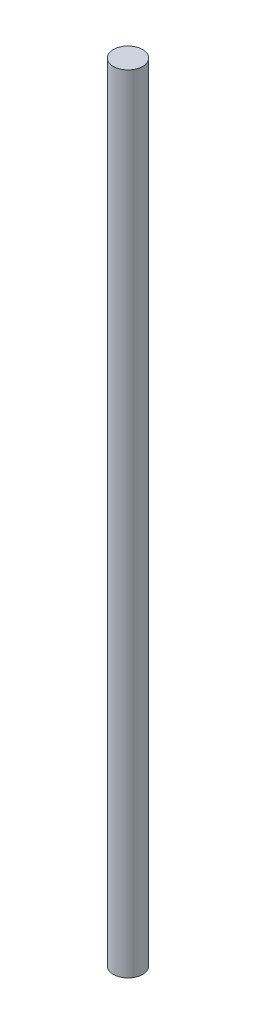
ISO-10303-21;
HEADER;
FILE_DESCRIPTION(('STEP AP214'),'2;1');
FILE_NAME('part.step','',(''),(''),'','','');
FILE_SCHEMA(('AUTOMOTIVE_DESIGN { 1 0 10303 214 1 1 1 1 }'));
ENDSEC;
DATA;
#1=APPLICATION_CONTEXT('core data for automotive mechanical design processes');
#2=APPLICATION_PROTOCOL_DEFINITION('international standard','automotive_design',2000,#1);
#3=PRODUCT_CONTEXT('',#1,'mechanical');
#4=PRODUCT('Part','Part','',(#3));
#5=PRODUCT_RELATED_PRODUCT_CATEGORY('part','',(#4));
#6=PRODUCT_DEFINITION_FORMATION('','',#4);
#7=PRODUCT_DEFINITION_CONTEXT('part definition',#1,'design');
#8=PRODUCT_DEFINITION('design','',#6,#7);
#9=PRODUCT_DEFINITION_SHAPE('','',#8);
#10=(LENGTH_UNIT() NAMED_UNIT(*) SI_UNIT(.MILLI.,.METRE.));
#11=(NAMED_UNIT(*) PLANE_ANGLE_UNIT() SI_UNIT($,.RADIAN.));
#12=(NAMED_UNIT(*) SI_UNIT($,.STERADIAN.) SOLID_ANGLE_UNIT());
#13=UNCERTAINTY_MEASURE_WITH_UNIT(LENGTH_MEASURE(1.E-05),#10,'distance_accuracy_value','');
#14=(GEOMETRIC_REPRESENTATION_CONTEXT(3) GLOBAL_UNCERTAINTY_ASSIGNED_CONTEXT((#13)) GLOBAL_UNIT_ASSIGNED_CONTEXT((#10,
#11,#12)) REPRESENTATION_CONTEXT('',''));
#15=CARTESIAN_POINT('',(0.,0.,0.));
#16=DIRECTION('',(0.,0.,1.));
#17=DIRECTION('',(1.,0.,0.));
#18=AXIS2_PLACEMENT_3D('',#15,#16,#17);
#19=CARTESIAN_POINT('',(0.,76.2,0.));
#20=DIRECTION('',(0.,-1.,0.));
#21=DIRECTION('',(0.,0.,-1.));
#22=AXIS2_PLACEMENT_3D('',#19,#20,#21);
#23=CYLINDRICAL_SURFACE('',#22,1.4224);
#24=CARTESIAN_POINT('',(0.,76.2,0.));
#25=DIRECTION('',(0.,1.,0.));
#26=DIRECTION('',(0.,0.,1.));
#27=AXIS2_PLACEMENT_3D('',#24,#25,#26);
#28=CIRCLE('',#27,1.4224);
#29=CARTESIAN_POINT('',(0.,76.2,-1.4224));
#30=VERTEX_POINT('',#29);
#31=EDGE_CURVE('E10',#30,#30,#28,.T.);
#32=CARTESIAN_POINT('',(0.,0.,0.));
#33=DIRECTION('',(0.,1.,0.));
#34=DIRECTION('',(0.,0.,1.));
#35=AXIS2_PLACEMENT_3D('',#32,#33,#34);
#36=CIRCLE('',#35,1.4224);
#37=CARTESIAN_POINT('',(0.,0.,-1.4224));
#38=VERTEX_POINT('',#37);
#39=EDGE_CURVE('E34',#38,#38,#36,.T.);
#40=CARTESIAN_POINT('',(0.,76.2,-1.4224));
#41=CARTESIAN_POINT('',(0.,75.40625,-1.4224));
#42=CARTESIAN_POINT('',(0.,74.6125,-1.4224));
#43=CARTESIAN_POINT('',(0.,73.025,-1.4224));
#44=CARTESIAN_POINT('',(0.,72.23125,-1.4224));
#45=CARTESIAN_POINT('',(0.,70.64375,-1.4224));
#46=CARTESIAN_POINT('',(0.,69.85,-1.4224));
#47=CARTESIAN_POINT('',(0.,68.2625,-1.4224));
#48=CARTESIAN_POINT('',(0.,67.46875,-1.4224));
#49=CARTESIAN_POINT('',(0.,65.88125,-1.4224));
#50=CARTESIAN_POINT('',(0.,65.0875,-1.4224));
#51=CARTESIAN_POINT('',(0.,63.5,-1.4224));
#52=CARTESIAN_POINT('',(0.,62.70625,-1.4224));
#53=CARTESIAN_POINT('',(0.,61.11875,-1.4224));
#54=CARTESIAN_POINT('',(0.,60.325,-1.4224));
#55=CARTESIAN_POINT('',(0.,58.7375,-1.4224));
#56=CARTESIAN_POINT('',(0.,57.94375,-1.4224));
#57=CARTESIAN_POINT('',(0.,56.35625,-1.4224));
#58=CARTESIAN_POINT('',(0.,55.5625,-1.4224));
#59=CARTESIAN_POINT('',(0.,53.975,-1.4224));
#60=CARTESIAN_POINT('',(0.,53.18125,-1.4224));
#61=CARTESIAN_POINT('',(0.,51.59375,-1.4224));
#62=CARTESIAN_POINT('',(0.,50.8,-1.4224));
#63=CARTESIAN_POINT('',(0.,49.2125,-1.4224));
#64=CARTESIAN_POINT('',(0.,48.41875,-1.4224));
#65=CARTESIAN_POINT('',(0.,46.83125,-1.4224));
#66=CARTESIAN_POINT('',(0.,46.0375,-1.4224));
#67=CARTESIAN_POINT('',(0.,44.45,-1.4224));
#68=CARTESIAN_POINT('',(0.,43.65625,-1.4224));
#69=CARTESIAN_POINT('',(0.,42.06875,-1.4224));
#70=CARTESIAN_POINT('',(0.,41.275,-1.4224));
#71=CARTESIAN_POINT('',(0.,39.6875,-1.4224));
#72=CARTESIAN_POINT('',(0.,38.89375,-1.4224));
#73=CARTESIAN_POINT('',(0.,37.30625,-1.4224));
#74=CARTESIAN_POINT('',(0.,36.5125,-1.4224));
#75=CARTESIAN_POINT('',(0.,34.925,-1.4224));
#76=CARTESIAN_POINT('',(0.,34.13125,-1.4224));
#77=CARTESIAN_POINT('',(0.,32.54375,-1.4224));
#78=CARTESIAN_POINT('',(0.,31.75,-1.4224));
#79=CARTESIAN_POINT('',(0.,30.1625,-1.4224));
#80=CARTESIAN_POINT('',(0.,29.36875,-1.4224));
#81=CARTESIAN_POINT('',(0.,27.78125,-1.4224));
#82=CARTESIAN_POINT('',(0.,26.9875,-1.4224));
#83=CARTESIAN_POINT('',(0.,25.4,-1.4224));
#84=CARTESIAN_POINT('',(0.,24.60625,-1.4224));
#85=CARTESIAN_POINT('',(0.,23.01875,-1.4224));
#86=CARTESIAN_POINT('',(0.,22.225,-1.4224));
#87=CARTESIAN_POINT('',(0.,20.6375,-1.4224));
#88=CARTESIAN_POINT('',(0.,19.84375,-1.4224));
#89=CARTESIAN_POINT('',(0.,18.25625,-1.4224));
#90=CARTESIAN_POINT('',(0.,17.4625,-1.4224));
#91=CARTESIAN_POINT('',(0.,15.875,-1.4224));
#92=CARTESIAN_POINT('',(0.,15.08125,-1.4224));
#93=CARTESIAN_POINT('',(0.,13.49375,-1.4224));
#94=CARTESIAN_POINT('',(0.,12.7,-1.4224));
#95=CARTESIAN_POINT('',(0.,11.1125,-1.4224));
#96=CARTESIAN_POINT('',(0.,10.31875,-1.4224));
#97=CARTESIAN_POINT('',(0.,8.73125,-1.4224));
#98=CARTESIAN_POINT('',(0.,7.93750000000001,-1.4224));
#99=CARTESIAN_POINT('',(0.,6.35,-1.4224));
#100=CARTESIAN_POINT('',(0.,5.55625,-1.4224));
#101=CARTESIAN_POINT('',(0.,3.96875,-1.4224));
#102=CARTESIAN_POINT('',(0.,3.175,-1.4224));
#103=CARTESIAN_POINT('',(0.,1.5875,-1.4224));
#104=CARTESIAN_POINT('',(0.,0.793750000000001,-1.4224));
#105=CARTESIAN_POINT('',(0.,0.,-1.4224));
#106=B_SPLINE_CURVE_WITH_KNOTS('',3,(#40,#41,#42,#43,#44,#45,#46,#47,#48,#49,#50,#51,#52,#53,
#54,#55,#56,#57,#58,#59,#60,#61,#62,#63,#64,#65,#66,#67,#68,#69,#70,#71,#72,#73,#74,#75,#76,#77,
#78,#79,#80,#81,#82,#83,#84,#85,#86,#87,#88,#89,#90,#91,#92,#93,#94,#95,#96,#97,#98,#99,#100,
#101,#102,#103,#104,#105),.UNSPECIFIED.,.F.,.F.,(4,2,2,2,2,2,2,2,2,2,2,2,2,2,2,2,2,2,2,2,2,2,2,
2,2,2,2,2,2,2,2,2,4),(0.,2.38124999999999,4.76249999999999,7.14374999999999,9.52499999999999,
11.90625,14.2875,16.66875,19.05,21.43125,23.8125,26.19375,28.575,30.95625,33.3375,35.71875,38.1,
40.48125,42.8625,45.24375,47.625,50.00625,52.3875,54.76875,57.15,59.53125,61.9125,64.29375,
66.675,69.05625,71.4375,73.81875,76.2),.UNSPECIFIED.);
#107=EDGE_CURVE('BSEAM31',#30,#38,#106,.T.);
#108=ORIENTED_EDGE('',*,*,#31,.F.);
#109=ORIENTED_EDGE('',*,*,#39,.T.);
#110=ORIENTED_EDGE('',*,*,#107,.T.);
#111=ORIENTED_EDGE('',*,*,#107,.F.);
#112=EDGE_LOOP('',(#108,#110,#109,#111));
#113=FACE_BOUND('',#112,.T.);
#114=ADVANCED_FACE('F31',(#113),#23,.T.);
#115=CARTESIAN_POINT('',(0.,76.2,0.));
#116=DIRECTION('',(0.,1.,0.));
#117=DIRECTION('',(0.,0.,1.));
#118=AXIS2_PLACEMENT_3D('',#115,#116,#117);
#119=PLANE('',#118);
#120=ORIENTED_EDGE('',*,*,#31,.T.);
#121=EDGE_LOOP('',(#120));
#122=FACE_BOUND('',#121,.T.);
#123=ADVANCED_FACE('F46',(#122),#119,.T.);
#124=CARTESIAN_POINT('',(0.,0.,0.));
#125=DIRECTION('',(0.,1.,0.));
#126=DIRECTION('',(0.,0.,1.));
#127=AXIS2_PLACEMENT_3D('',#124,#125,#126);
#128=PLANE('',#127);
#129=ORIENTED_EDGE('',*,*,#39,.F.);
#130=EDGE_LOOP('',(#129));
#131=FACE_BOUND('',#130,.T.);
#132=ADVANCED_FACE('F44',(#131),#128,.F.);
#133=CLOSED_SHELL('',(#114,#123,#132));
#134=MANIFOLD_SOLID_BREP('B2',#133);
#135=ADVANCED_BREP_SHAPE_REPRESENTATION('',(#18,#134),#14);
#136=SHAPE_DEFINITION_REPRESENTATION(#9,#135);
ENDSEC;
END-ISO-10303-21;
